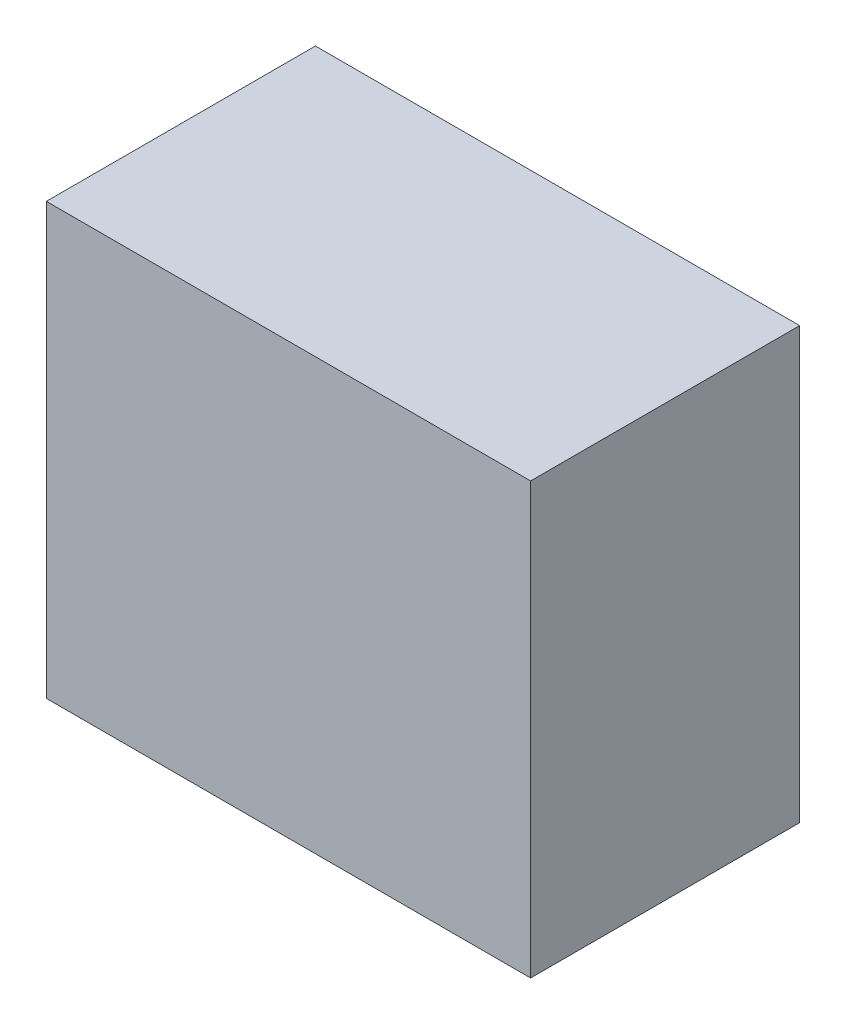
ISO-10303-21;
HEADER;
FILE_DESCRIPTION(('STEP AP214'),'2;1');
FILE_NAME('part.step','',(''),(''),'','','');
FILE_SCHEMA(('AUTOMOTIVE_DESIGN { 1 0 10303 214 1 1 1 1 }'));
ENDSEC;
DATA;
#1=APPLICATION_CONTEXT('core data for automotive mechanical design processes');
#2=APPLICATION_PROTOCOL_DEFINITION('international standard','automotive_design',2000,#1);
#3=PRODUCT_CONTEXT('',#1,'mechanical');
#4=PRODUCT('Part','Part','',(#3));
#5=PRODUCT_RELATED_PRODUCT_CATEGORY('part','',(#4));
#6=PRODUCT_DEFINITION_FORMATION('','',#4);
#7=PRODUCT_DEFINITION_CONTEXT('part definition',#1,'design');
#8=PRODUCT_DEFINITION('design','',#6,#7);
#9=PRODUCT_DEFINITION_SHAPE('','',#8);
#10=(LENGTH_UNIT() NAMED_UNIT(*) SI_UNIT(.MILLI.,.METRE.));
#11=(NAMED_UNIT(*) PLANE_ANGLE_UNIT() SI_UNIT($,.RADIAN.));
#12=(NAMED_UNIT(*) SI_UNIT($,.STERADIAN.) SOLID_ANGLE_UNIT());
#13=UNCERTAINTY_MEASURE_WITH_UNIT(LENGTH_MEASURE(1.E-05),#10,'distance_accuracy_value','');
#14=(GEOMETRIC_REPRESENTATION_CONTEXT(3) GLOBAL_UNCERTAINTY_ASSIGNED_CONTEXT((#13)) GLOBAL_UNIT_ASSIGNED_CONTEXT((#10,
#11,#12)) REPRESENTATION_CONTEXT('',''));
#15=CARTESIAN_POINT('',(0.,0.,0.));
#16=DIRECTION('',(0.,0.,1.));
#17=DIRECTION('',(1.,0.,0.));
#18=AXIS2_PLACEMENT_3D('',#15,#16,#17);
#19=CARTESIAN_POINT('',(0.22500082,0.1999996,0.));
#20=DIRECTION('',(0.,0.,1.));
#21=DIRECTION('',(1.,0.,0.));
#22=AXIS2_PLACEMENT_3D('',#19,#20,#21);
#23=PLANE('',#22);
#24=DIRECTION('',(0.,1.,0.));
#25=VECTOR('',#24,1.);
#26=CARTESIAN_POINT('',(-0.22499828,-0.1999996,0.));
#27=LINE('',#26,#25);
#28=CARTESIAN_POINT('',(-0.22499828,0.1999996,0.));
#29=VERTEX_POINT('',#28);
#30=CARTESIAN_POINT('',(-0.22499828,-0.1999996,0.));
#31=VERTEX_POINT('',#30);
#32=EDGE_CURVE('E80',#29,#31,#27,.F.);
#33=ORIENTED_EDGE('',*,*,#32,.F.);
#34=DIRECTION('',(1.,0.,0.));
#35=VECTOR('',#34,1.);
#36=CARTESIAN_POINT('',(-0.22499828,0.1999996,0.));
#37=LINE('',#36,#35);
#38=CARTESIAN_POINT('',(0.22500082,0.1999996,0.));
#39=VERTEX_POINT('',#38);
#40=EDGE_CURVE('E68',#39,#29,#37,.F.);
#41=ORIENTED_EDGE('',*,*,#40,.F.);
#42=DIRECTION('',(0.,1.,0.));
#43=VECTOR('',#42,1.);
#44=CARTESIAN_POINT('',(0.22500082,0.1999996,0.));
#45=LINE('',#44,#43);
#46=CARTESIAN_POINT('',(0.22500082,-0.1999996,0.));
#47=VERTEX_POINT('',#46);
#48=EDGE_CURVE('E55',#47,#39,#45,.T.);
#49=ORIENTED_EDGE('',*,*,#48,.F.);
#50=DIRECTION('',(1.,0.,0.));
#51=VECTOR('',#50,1.);
#52=CARTESIAN_POINT('',(0.22500082,-0.1999996,0.));
#53=LINE('',#52,#51);
#54=EDGE_CURVE('E20',#31,#47,#53,.T.);
#55=ORIENTED_EDGE('',*,*,#54,.F.);
#56=EDGE_LOOP('',(#33,#41,#49,#55));
#57=FACE_BOUND('',#56,.T.);
#58=ADVANCED_FACE('F17',(#57),#23,.F.);
#59=CARTESIAN_POINT('',(0.22500082,-0.1999996,0.));
#60=DIRECTION('',(0.,-1.,0.));
#61=DIRECTION('',(0.,0.,-1.));
#62=AXIS2_PLACEMENT_3D('',#59,#60,#61);
#63=PLANE('',#62);
#64=DIRECTION('',(0.,0.,-1.));
#65=VECTOR('',#64,1.);
#66=CARTESIAN_POINT('',(0.22500082,-0.1999996,0.));
#67=LINE('',#66,#65);
#68=CARTESIAN_POINT('',(0.22500082,-0.1999996,0.25));
#69=VERTEX_POINT('',#68);
#70=EDGE_CURVE('E61',#69,#47,#67,.T.);
#71=ORIENTED_EDGE('',*,*,#70,.F.);
#72=DIRECTION('',(1.,0.,0.));
#73=VECTOR('',#72,1.);
#74=CARTESIAN_POINT('',(0.22500082,-0.1999996,0.25));
#75=LINE('',#74,#73);
#76=CARTESIAN_POINT('',(-0.22499828,-0.1999996,0.25));
#77=VERTEX_POINT('',#76);
#78=EDGE_CURVE('E83',#77,#69,#75,.T.);
#79=ORIENTED_EDGE('',*,*,#78,.F.);
#80=DIRECTION('',(0.,0.,1.));
#81=VECTOR('',#80,1.);
#82=CARTESIAN_POINT('',(-0.22499828,-0.1999996,0.));
#83=LINE('',#82,#81);
#84=EDGE_CURVE('E64',#31,#77,#83,.T.);
#85=ORIENTED_EDGE('',*,*,#84,.F.);
#86=ORIENTED_EDGE('',*,*,#54,.T.);
#87=EDGE_LOOP('',(#71,#79,#85,#86));
#88=FACE_BOUND('',#87,.T.);
#89=ADVANCED_FACE('F60',(#88),#63,.T.);
#90=CARTESIAN_POINT('',(0.22500082,0.1999996,0.));
#91=DIRECTION('',(1.,0.,0.));
#92=DIRECTION('',(0.,0.,-1.));
#93=AXIS2_PLACEMENT_3D('',#90,#91,#92);
#94=PLANE('',#93);
#95=DIRECTION('',(0.,0.,1.));
#96=VECTOR('',#95,1.);
#97=CARTESIAN_POINT('',(0.22500082,0.1999996,0.));
#98=LINE('',#97,#96);
#99=CARTESIAN_POINT('',(0.22500082,0.1999996,0.25));
#100=VERTEX_POINT('',#99);
#101=EDGE_CURVE('E70',#100,#39,#98,.F.);
#102=ORIENTED_EDGE('',*,*,#101,.F.);
#103=DIRECTION('',(0.,1.,0.));
#104=VECTOR('',#103,1.);
#105=CARTESIAN_POINT('',(0.22500082,0.1999996,0.25));
#106=LINE('',#105,#104);
#107=EDGE_CURVE('E74',#69,#100,#106,.T.);
#108=ORIENTED_EDGE('',*,*,#107,.F.);
#109=ORIENTED_EDGE('',*,*,#70,.T.);
#110=ORIENTED_EDGE('',*,*,#48,.T.);
#111=EDGE_LOOP('',(#102,#108,#109,#110));
#112=FACE_BOUND('',#111,.T.);
#113=ADVANCED_FACE('F72',(#112),#94,.T.);
#114=CARTESIAN_POINT('',(-0.22499828,0.1999996,0.));
#115=DIRECTION('',(0.,1.,0.));
#116=DIRECTION('',(0.,0.,1.));
#117=AXIS2_PLACEMENT_3D('',#114,#115,#116);
#118=PLANE('',#117);
#119=DIRECTION('',(0.,0.,1.));
#120=VECTOR('',#119,1.);
#121=CARTESIAN_POINT('',(-0.22499828,0.1999996,0.));
#122=LINE('',#121,#120);
#123=CARTESIAN_POINT('',(-0.22499828,0.1999996,0.25));
#124=VERTEX_POINT('',#123);
#125=EDGE_CURVE('E35',#124,#29,#122,.F.);
#126=ORIENTED_EDGE('',*,*,#125,.F.);
#127=DIRECTION('',(1.,0.,0.));
#128=VECTOR('',#127,1.);
#129=CARTESIAN_POINT('',(0.22500082,0.1999996,0.25));
#130=LINE('',#129,#128);
#131=EDGE_CURVE('E26',#100,#124,#130,.F.);
#132=ORIENTED_EDGE('',*,*,#131,.F.);
#133=ORIENTED_EDGE('',*,*,#101,.T.);
#134=ORIENTED_EDGE('',*,*,#40,.T.);
#135=EDGE_LOOP('',(#126,#132,#133,#134));
#136=FACE_BOUND('',#135,.T.);
#137=ADVANCED_FACE('F89',(#136),#118,.T.);
#138=CARTESIAN_POINT('',(-0.22499828,-0.1999996,0.));
#139=DIRECTION('',(-1.,0.,0.));
#140=DIRECTION('',(0.,0.,1.));
#141=AXIS2_PLACEMENT_3D('',#138,#139,#140);
#142=PLANE('',#141);
#143=ORIENTED_EDGE('',*,*,#84,.T.);
#144=DIRECTION('',(0.,1.,0.));
#145=VECTOR('',#144,1.);
#146=CARTESIAN_POINT('',(-0.22499828,0.1999996,0.25));
#147=LINE('',#146,#145);
#148=EDGE_CURVE('E11',#124,#77,#147,.F.);
#149=ORIENTED_EDGE('',*,*,#148,.F.);
#150=ORIENTED_EDGE('',*,*,#125,.T.);
#151=ORIENTED_EDGE('',*,*,#32,.T.);
#152=EDGE_LOOP('',(#143,#149,#150,#151));
#153=FACE_BOUND('',#152,.T.);
#154=ADVANCED_FACE('F91',(#153),#142,.T.);
#155=CARTESIAN_POINT('',(0.22500082,0.1999996,0.25));
#156=DIRECTION('',(0.,0.,1.));
#157=DIRECTION('',(1.,0.,0.));
#158=AXIS2_PLACEMENT_3D('',#155,#156,#157);
#159=PLANE('',#158);
#160=ORIENTED_EDGE('',*,*,#131,.T.);
#161=ORIENTED_EDGE('',*,*,#148,.T.);
#162=ORIENTED_EDGE('',*,*,#78,.T.);
#163=ORIENTED_EDGE('',*,*,#107,.T.);
#164=EDGE_LOOP('',(#160,#161,#162,#163));
#165=FACE_BOUND('',#164,.T.);
#166=ADVANCED_FACE('F88',(#165),#159,.T.);
#167=CLOSED_SHELL('',(#58,#89,#113,#137,#154,#166));
#168=MANIFOLD_SOLID_BREP('B1',#167);
#169=ADVANCED_BREP_SHAPE_REPRESENTATION('',(#18,#168),#14);
#170=SHAPE_DEFINITION_REPRESENTATION(#9,#169);
ENDSEC;
END-ISO-10303-21;
